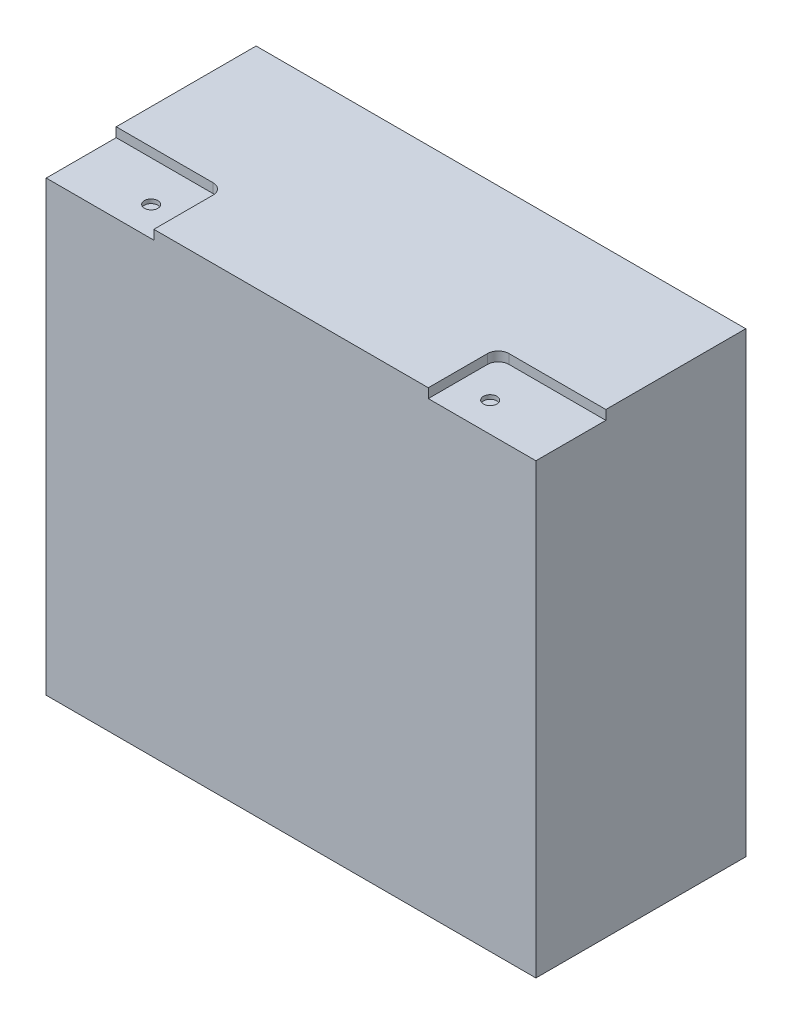
ISO-10303-21;
HEADER;
FILE_DESCRIPTION(('STEP AP214'),'2;1');
FILE_NAME('part.step','',(''),(''),'','','');
FILE_SCHEMA(('AUTOMOTIVE_DESIGN { 1 0 10303 214 1 1 1 1 }'));
ENDSEC;
DATA;
#1=APPLICATION_CONTEXT('core data for automotive mechanical design processes');
#2=APPLICATION_PROTOCOL_DEFINITION('international standard','automotive_design',2000,#1);
#3=PRODUCT_CONTEXT('',#1,'mechanical');
#4=PRODUCT('Part','Part','',(#3));
#5=PRODUCT_RELATED_PRODUCT_CATEGORY('part','',(#4));
#6=PRODUCT_DEFINITION_FORMATION('','',#4);
#7=PRODUCT_DEFINITION_CONTEXT('part definition',#1,'design');
#8=PRODUCT_DEFINITION('design','',#6,#7);
#9=PRODUCT_DEFINITION_SHAPE('','',#8);
#10=(LENGTH_UNIT() NAMED_UNIT(*) SI_UNIT(.MILLI.,.METRE.));
#11=(NAMED_UNIT(*) PLANE_ANGLE_UNIT() SI_UNIT($,.RADIAN.));
#12=(NAMED_UNIT(*) SI_UNIT($,.STERADIAN.) SOLID_ANGLE_UNIT());
#13=UNCERTAINTY_MEASURE_WITH_UNIT(LENGTH_MEASURE(1.E-05),#10,'distance_accuracy_value','');
#14=(GEOMETRIC_REPRESENTATION_CONTEXT(3) GLOBAL_UNCERTAINTY_ASSIGNED_CONTEXT((#13)) GLOBAL_UNIT_ASSIGNED_CONTEXT((#10,
#11,#12)) REPRESENTATION_CONTEXT('',''));
#15=CARTESIAN_POINT('',(0.,0.,0.));
#16=DIRECTION('',(0.,0.,1.));
#17=DIRECTION('',(1.,0.,0.));
#18=AXIS2_PLACEMENT_3D('',#15,#16,#17);
#19=CARTESIAN_POINT('',(91.,170.,39.));
#20=DIRECTION('',(-1.,0.,0.));
#21=DIRECTION('',(0.,0.,1.));
#22=AXIS2_PLACEMENT_3D('',#19,#20,#21);
#23=PLANE('',#22);
#24=DIRECTION('',(0.,0.,-1.));
#25=VECTOR('',#24,1.);
#26=CARTESIAN_POINT('',(91.,170.,39.));
#27=LINE('',#26,#25);
#28=CARTESIAN_POINT('',(91.,170.,13.));
#29=VERTEX_POINT('',#28);
#30=CARTESIAN_POINT('',(91.,170.,-39.));
#31=VERTEX_POINT('',#30);
#32=EDGE_CURVE('E231',#29,#31,#27,.T.);
#33=ORIENTED_EDGE('',*,*,#32,.F.);
#34=DIRECTION('',(0.,1.,0.));
#35=VECTOR('',#34,1.);
#36=CARTESIAN_POINT('',(91.,166.5,13.));
#37=LINE('',#36,#35);
#38=CARTESIAN_POINT('',(91.,166.5,13.));
#39=VERTEX_POINT('',#38);
#40=EDGE_CURVE('E200',#39,#29,#37,.T.);
#41=ORIENTED_EDGE('',*,*,#40,.F.);
#42=DIRECTION('',(0.,0.,-1.));
#43=VECTOR('',#42,1.);
#44=CARTESIAN_POINT('',(91.,166.5,39.));
#45=LINE('',#44,#43);
#46=CARTESIAN_POINT('',(91.,166.5,39.));
#47=VERTEX_POINT('',#46);
#48=EDGE_CURVE('E220',#47,#39,#45,.T.);
#49=ORIENTED_EDGE('',*,*,#48,.F.);
#50=DIRECTION('',(0.,-1.,0.));
#51=VECTOR('',#50,1.);
#52=CARTESIAN_POINT('',(91.,170.,39.));
#53=LINE('',#52,#51);
#54=CARTESIAN_POINT('',(91.,0.,39.));
#55=VERTEX_POINT('',#54);
#56=EDGE_CURVE('E154',#47,#55,#53,.T.);
#57=ORIENTED_EDGE('',*,*,#56,.T.);
#58=DIRECTION('',(0.,0.,-1.));
#59=VECTOR('',#58,1.);
#60=CARTESIAN_POINT('',(91.,0.,39.));
#61=LINE('',#60,#59);
#62=CARTESIAN_POINT('',(91.,0.,-39.));
#63=VERTEX_POINT('',#62);
#64=EDGE_CURVE('E228',#55,#63,#61,.T.);
#65=ORIENTED_EDGE('',*,*,#64,.T.);
#66=DIRECTION('',(0.,-1.,0.));
#67=VECTOR('',#66,1.);
#68=CARTESIAN_POINT('',(91.,170.,-39.));
#69=LINE('',#68,#67);
#70=EDGE_CURVE('E156',#31,#63,#69,.T.);
#71=ORIENTED_EDGE('',*,*,#70,.F.);
#72=EDGE_LOOP('',(#33,#41,#49,#57,#65,#71));
#73=FACE_BOUND('',#72,.T.);
#74=ADVANCED_FACE('F37',(#73),#23,.F.);
#75=CARTESIAN_POINT('',(-91.,170.,-39.));
#76=DIRECTION('',(0.,0.,1.));
#77=DIRECTION('',(1.,0.,0.));
#78=AXIS2_PLACEMENT_3D('',#75,#76,#77);
#79=PLANE('',#78);
#80=DIRECTION('',(-1.,0.,0.));
#81=VECTOR('',#80,1.);
#82=CARTESIAN_POINT('',(-91.,0.,-39.));
#83=LINE('',#82,#81);
#84=CARTESIAN_POINT('',(-91.,0.,-39.));
#85=VERTEX_POINT('',#84);
#86=EDGE_CURVE('E241',#63,#85,#83,.T.);
#87=ORIENTED_EDGE('',*,*,#86,.T.);
#88=DIRECTION('',(0.,-1.,0.));
#89=VECTOR('',#88,1.);
#90=CARTESIAN_POINT('',(-91.,170.,-39.));
#91=LINE('',#90,#89);
#92=CARTESIAN_POINT('',(-91.,170.,-39.));
#93=VERTEX_POINT('',#92);
#94=EDGE_CURVE('E153',#93,#85,#91,.T.);
#95=ORIENTED_EDGE('',*,*,#94,.F.);
#96=DIRECTION('',(-1.,0.,0.));
#97=VECTOR('',#96,1.);
#98=CARTESIAN_POINT('',(-91.,170.,-39.));
#99=LINE('',#98,#97);
#100=EDGE_CURVE('E233',#31,#93,#99,.T.);
#101=ORIENTED_EDGE('',*,*,#100,.F.);
#102=ORIENTED_EDGE('',*,*,#70,.T.);
#103=EDGE_LOOP('',(#87,#95,#101,#102));
#104=FACE_BOUND('',#103,.T.);
#105=ADVANCED_FACE('F268',(#104),#79,.F.);
#106=CARTESIAN_POINT('',(-91.,170.,39.));
#107=DIRECTION('',(1.,0.,0.));
#108=DIRECTION('',(0.,0.,-1.));
#109=AXIS2_PLACEMENT_3D('',#106,#107,#108);
#110=PLANE('',#109);
#111=DIRECTION('',(0.,0.,1.));
#112=VECTOR('',#111,1.);
#113=CARTESIAN_POINT('',(-91.,166.5,39.));
#114=LINE('',#113,#112);
#115=CARTESIAN_POINT('',(-91.,166.5,13.));
#116=VERTEX_POINT('',#115);
#117=CARTESIAN_POINT('',(-91.,166.5,39.));
#118=VERTEX_POINT('',#117);
#119=EDGE_CURVE('E125',#116,#118,#114,.T.);
#120=ORIENTED_EDGE('',*,*,#119,.F.);
#121=DIRECTION('',(0.,1.,0.));
#122=VECTOR('',#121,1.);
#123=CARTESIAN_POINT('',(-91.,166.5,13.));
#124=LINE('',#123,#122);
#125=CARTESIAN_POINT('',(-91.,170.,13.));
#126=VERTEX_POINT('',#125);
#127=EDGE_CURVE('E169',#116,#126,#124,.T.);
#128=ORIENTED_EDGE('',*,*,#127,.T.);
#129=DIRECTION('',(0.,0.,1.));
#130=VECTOR('',#129,1.);
#131=CARTESIAN_POINT('',(-91.,170.,39.));
#132=LINE('',#131,#130);
#133=EDGE_CURVE('E236',#93,#126,#132,.T.);
#134=ORIENTED_EDGE('',*,*,#133,.F.);
#135=ORIENTED_EDGE('',*,*,#94,.T.);
#136=DIRECTION('',(0.,0.,1.));
#137=VECTOR('',#136,1.);
#138=CARTESIAN_POINT('',(-91.,0.,39.));
#139=LINE('',#138,#137);
#140=CARTESIAN_POINT('',(-91.,0.,39.));
#141=VERTEX_POINT('',#140);
#142=EDGE_CURVE('E151',#85,#141,#139,.T.);
#143=ORIENTED_EDGE('',*,*,#142,.T.);
#144=DIRECTION('',(0.,-1.,0.));
#145=VECTOR('',#144,1.);
#146=CARTESIAN_POINT('',(-91.,170.,39.));
#147=LINE('',#146,#145);
#148=EDGE_CURVE('E143',#118,#141,#147,.T.);
#149=ORIENTED_EDGE('',*,*,#148,.F.);
#150=EDGE_LOOP('',(#120,#128,#134,#135,#143,#149));
#151=FACE_BOUND('',#150,.T.);
#152=ADVANCED_FACE('F148',(#151),#110,.F.);
#153=CARTESIAN_POINT('',(-91.,170.,39.));
#154=DIRECTION('',(0.,0.,-1.));
#155=DIRECTION('',(-1.,0.,0.));
#156=AXIS2_PLACEMENT_3D('',#153,#154,#155);
#157=PLANE('',#156);
#158=DIRECTION('',(1.,0.,0.));
#159=VECTOR('',#158,1.);
#160=CARTESIAN_POINT('',(-91.,170.,39.));
#161=LINE('',#160,#159);
#162=CARTESIAN_POINT('',(-51.,170.,39.));
#163=VERTEX_POINT('',#162);
#164=CARTESIAN_POINT('',(51.,170.,39.));
#165=VERTEX_POINT('',#164);
#166=EDGE_CURVE('E158',#163,#165,#161,.T.);
#167=ORIENTED_EDGE('',*,*,#166,.F.);
#168=DIRECTION('',(0.,1.,0.));
#169=VECTOR('',#168,1.);
#170=CARTESIAN_POINT('',(-51.,166.5,39.));
#171=LINE('',#170,#169);
#172=CARTESIAN_POINT('',(-51.,166.5,39.));
#173=VERTEX_POINT('',#172);
#174=EDGE_CURVE('E145',#173,#163,#171,.T.);
#175=ORIENTED_EDGE('',*,*,#174,.F.);
#176=DIRECTION('',(1.,0.,0.));
#177=VECTOR('',#176,1.);
#178=CARTESIAN_POINT('',(-91.,166.5,39.));
#179=LINE('',#178,#177);
#180=EDGE_CURVE('E129',#118,#173,#179,.T.);
#181=ORIENTED_EDGE('',*,*,#180,.F.);
#182=ORIENTED_EDGE('',*,*,#148,.T.);
#183=DIRECTION('',(1.,0.,0.));
#184=VECTOR('',#183,1.);
#185=CARTESIAN_POINT('',(-91.,0.,39.));
#186=LINE('',#185,#184);
#187=EDGE_CURVE('E234',#141,#55,#186,.T.);
#188=ORIENTED_EDGE('',*,*,#187,.T.);
#189=ORIENTED_EDGE('',*,*,#56,.F.);
#190=DIRECTION('',(1.,0.,0.));
#191=VECTOR('',#190,1.);
#192=CARTESIAN_POINT('',(91.,166.5,39.));
#193=LINE('',#192,#191);
#194=CARTESIAN_POINT('',(51.,166.5,39.));
#195=VERTEX_POINT('',#194);
#196=EDGE_CURVE('E218',#195,#47,#193,.T.);
#197=ORIENTED_EDGE('',*,*,#196,.F.);
#198=DIRECTION('',(0.,1.,0.));
#199=VECTOR('',#198,1.);
#200=CARTESIAN_POINT('',(51.,166.5,39.));
#201=LINE('',#200,#199);
#202=EDGE_CURVE('E216',#195,#165,#201,.T.);
#203=ORIENTED_EDGE('',*,*,#202,.T.);
#204=EDGE_LOOP('',(#167,#175,#181,#182,#188,#189,#197,#203));
#205=FACE_BOUND('',#204,.T.);
#206=ADVANCED_FACE('F141',(#205),#157,.F.);
#207=CARTESIAN_POINT('',(0.,170.,0.));
#208=DIRECTION('',(0.,-1.,0.));
#209=DIRECTION('',(0.,0.,-1.));
#210=AXIS2_PLACEMENT_3D('',#207,#208,#209);
#211=PLANE('',#210);
#212=ORIENTED_EDGE('',*,*,#133,.T.);
#213=DIRECTION('',(-1.,0.,0.));
#214=VECTOR('',#213,1.);
#215=CARTESIAN_POINT('',(-91.,170.,13.));
#216=LINE('',#215,#214);
#217=CARTESIAN_POINT('',(-55.,170.,13.));
#218=VERTEX_POINT('',#217);
#219=EDGE_CURVE('E137',#218,#126,#216,.T.);
#220=ORIENTED_EDGE('',*,*,#219,.F.);
#221=CARTESIAN_POINT('',(-55.,170.,17.));
#222=DIRECTION('',(0.,-1.,0.));
#223=DIRECTION('',(0.,0.,-1.));
#224=AXIS2_PLACEMENT_3D('',#221,#222,#223);
#225=CIRCLE('',#224,4.);
#226=CARTESIAN_POINT('',(-51.,170.,17.));
#227=VERTEX_POINT('',#226);
#228=EDGE_CURVE('E11',#218,#227,#225,.T.);
#229=ORIENTED_EDGE('',*,*,#228,.T.);
#230=DIRECTION('',(0.,0.,-1.));
#231=VECTOR('',#230,1.);
#232=CARTESIAN_POINT('',(-51.,170.,39.));
#233=LINE('',#232,#231);
#234=EDGE_CURVE('E201',#163,#227,#233,.T.);
#235=ORIENTED_EDGE('',*,*,#234,.F.);
#236=ORIENTED_EDGE('',*,*,#166,.T.);
#237=DIRECTION('',(0.,0.,1.));
#238=VECTOR('',#237,1.);
#239=CARTESIAN_POINT('',(51.,170.,39.));
#240=LINE('',#239,#238);
#241=CARTESIAN_POINT('',(51.,170.,17.));
#242=VERTEX_POINT('',#241);
#243=EDGE_CURVE('E192',#242,#165,#240,.T.);
#244=ORIENTED_EDGE('',*,*,#243,.F.);
#245=CARTESIAN_POINT('',(55.,170.,17.));
#246=DIRECTION('',(0.,-1.,0.));
#247=DIRECTION('',(0.,0.,-1.));
#248=AXIS2_PLACEMENT_3D('',#245,#246,#247);
#249=CIRCLE('',#248,4.);
#250=CARTESIAN_POINT('',(55.,170.,13.));
#251=VERTEX_POINT('',#250);
#252=EDGE_CURVE('E45',#242,#251,#249,.T.);
#253=ORIENTED_EDGE('',*,*,#252,.T.);
#254=DIRECTION('',(-1.,0.,0.));
#255=VECTOR('',#254,1.);
#256=CARTESIAN_POINT('',(91.,170.,13.));
#257=LINE('',#256,#255);
#258=EDGE_CURVE('E189',#29,#251,#257,.T.);
#259=ORIENTED_EDGE('',*,*,#258,.F.);
#260=ORIENTED_EDGE('',*,*,#32,.T.);
#261=ORIENTED_EDGE('',*,*,#100,.T.);
#262=EDGE_LOOP('',(#212,#220,#229,#235,#236,#244,#253,#259,#260,#261));
#263=FACE_BOUND('',#262,.T.);
#264=ADVANCED_FACE('F188',(#263),#211,.F.);
#265=CARTESIAN_POINT('',(0.,0.,0.));
#266=DIRECTION('',(0.,-1.,0.));
#267=DIRECTION('',(0.,0.,-1.));
#268=AXIS2_PLACEMENT_3D('',#265,#266,#267);
#269=PLANE('',#268);
#270=ORIENTED_EDGE('',*,*,#64,.F.);
#271=ORIENTED_EDGE('',*,*,#187,.F.);
#272=ORIENTED_EDGE('',*,*,#142,.F.);
#273=ORIENTED_EDGE('',*,*,#86,.F.);
#274=EDGE_LOOP('',(#270,#271,#272,#273));
#275=FACE_BOUND('',#274,.T.);
#276=ADVANCED_FACE('F246',(#275),#269,.T.);
#277=CARTESIAN_POINT('',(0.,166.5,0.));
#278=DIRECTION('',(0.,1.,0.));
#279=DIRECTION('',(0.,0.,1.));
#280=AXIS2_PLACEMENT_3D('',#277,#278,#279);
#281=PLANE('',#280);
#282=DIRECTION('',(-1.,0.,0.));
#283=VECTOR('',#282,1.);
#284=CARTESIAN_POINT('',(91.,166.5,13.));
#285=LINE('',#284,#283);
#286=CARTESIAN_POINT('',(55.,166.5,13.));
#287=VERTEX_POINT('',#286);
#288=EDGE_CURVE('E212',#39,#287,#285,.T.);
#289=ORIENTED_EDGE('',*,*,#288,.T.);
#290=CARTESIAN_POINT('',(55.,166.5,17.));
#291=DIRECTION('',(0.,1.,0.));
#292=DIRECTION('',(0.,0.,1.));
#293=AXIS2_PLACEMENT_3D('',#290,#291,#292);
#294=CIRCLE('',#293,4.);
#295=CARTESIAN_POINT('',(51.,166.5,17.));
#296=VERTEX_POINT('',#295);
#297=EDGE_CURVE('E177',#287,#296,#294,.T.);
#298=ORIENTED_EDGE('',*,*,#297,.T.);
#299=DIRECTION('',(0.,0.,1.));
#300=VECTOR('',#299,1.);
#301=CARTESIAN_POINT('',(51.,166.5,39.));
#302=LINE('',#301,#300);
#303=EDGE_CURVE('E209',#296,#195,#302,.T.);
#304=ORIENTED_EDGE('',*,*,#303,.T.);
#305=ORIENTED_EDGE('',*,*,#196,.T.);
#306=ORIENTED_EDGE('',*,*,#48,.T.);
#307=EDGE_LOOP('',(#289,#298,#304,#305,#306));
#308=FACE_BOUND('',#307,.T.);
#309=CARTESIAN_POINT('',(63.,166.5,28.));
#310=DIRECTION('',(0.,1.,0.));
#311=DIRECTION('',(0.,0.,1.));
#312=AXIS2_PLACEMENT_3D('',#309,#310,#311);
#313=CIRCLE('',#312,2.50000000000001);
#314=CARTESIAN_POINT('',(63.,166.5,30.5));
#315=VERTEX_POINT('',#314);
#316=EDGE_CURVE('E165',#315,#315,#313,.F.);
#317=ORIENTED_EDGE('',*,*,#316,.T.);
#318=EDGE_LOOP('',(#317));
#319=FACE_BOUND('',#318,.T.);
#320=ADVANCED_FACE('F207',(#308,#319),#281,.T.);
#321=CARTESIAN_POINT('',(51.,166.5,39.));
#322=DIRECTION('',(-1.,0.,0.));
#323=DIRECTION('',(0.,0.,1.));
#324=AXIS2_PLACEMENT_3D('',#321,#322,#323);
#325=PLANE('',#324);
#326=ORIENTED_EDGE('',*,*,#303,.F.);
#327=DIRECTION('',(0.,1.,0.));
#328=VECTOR('',#327,1.);
#329=CARTESIAN_POINT('',(51.,170.,17.));
#330=LINE('',#329,#328);
#331=EDGE_CURVE('E164',#296,#242,#330,.T.);
#332=ORIENTED_EDGE('',*,*,#331,.T.);
#333=ORIENTED_EDGE('',*,*,#243,.T.);
#334=ORIENTED_EDGE('',*,*,#202,.F.);
#335=EDGE_LOOP('',(#326,#332,#333,#334));
#336=FACE_BOUND('',#335,.T.);
#337=ADVANCED_FACE('F214',(#336),#325,.F.);
#338=CARTESIAN_POINT('',(91.,166.5,13.));
#339=DIRECTION('',(0.,0.,-1.));
#340=DIRECTION('',(-1.,0.,0.));
#341=AXIS2_PLACEMENT_3D('',#338,#339,#340);
#342=PLANE('',#341);
#343=ORIENTED_EDGE('',*,*,#258,.T.);
#344=DIRECTION('',(0.,1.,0.));
#345=VECTOR('',#344,1.);
#346=CARTESIAN_POINT('',(55.,166.5,13.));
#347=LINE('',#346,#345);
#348=EDGE_CURVE('E175',#251,#287,#347,.F.);
#349=ORIENTED_EDGE('',*,*,#348,.T.);
#350=ORIENTED_EDGE('',*,*,#288,.F.);
#351=ORIENTED_EDGE('',*,*,#40,.T.);
#352=EDGE_LOOP('',(#343,#349,#350,#351));
#353=FACE_BOUND('',#352,.T.);
#354=ADVANCED_FACE('F197',(#353),#342,.F.);
#355=CARTESIAN_POINT('',(0.,166.5,0.));
#356=DIRECTION('',(0.,-1.,0.));
#357=DIRECTION('',(0.,0.,-1.));
#358=AXIS2_PLACEMENT_3D('',#355,#356,#357);
#359=PLANE('',#358);
#360=DIRECTION('',(0.,0.,-1.));
#361=VECTOR('',#360,1.);
#362=CARTESIAN_POINT('',(-51.,166.5,39.));
#363=LINE('',#362,#361);
#364=CARTESIAN_POINT('',(-51.,166.5,17.));
#365=VERTEX_POINT('',#364);
#366=EDGE_CURVE('E146',#173,#365,#363,.T.);
#367=ORIENTED_EDGE('',*,*,#366,.T.);
#368=CARTESIAN_POINT('',(-55.,166.5,17.));
#369=DIRECTION('',(0.,-1.,0.));
#370=DIRECTION('',(0.,0.,-1.));
#371=AXIS2_PLACEMENT_3D('',#368,#369,#370);
#372=CIRCLE('',#371,4.);
#373=CARTESIAN_POINT('',(-55.,166.5,13.));
#374=VERTEX_POINT('',#373);
#375=EDGE_CURVE('E183',#365,#374,#372,.F.);
#376=ORIENTED_EDGE('',*,*,#375,.T.);
#377=DIRECTION('',(-1.,0.,0.));
#378=VECTOR('',#377,1.);
#379=CARTESIAN_POINT('',(-91.,166.5,13.));
#380=LINE('',#379,#378);
#381=EDGE_CURVE('E132',#374,#116,#380,.T.);
#382=ORIENTED_EDGE('',*,*,#381,.T.);
#383=ORIENTED_EDGE('',*,*,#119,.T.);
#384=ORIENTED_EDGE('',*,*,#180,.T.);
#385=EDGE_LOOP('',(#367,#376,#382,#383,#384));
#386=FACE_BOUND('',#385,.T.);
#387=CARTESIAN_POINT('',(-62.9999999999998,166.5,28.0000000000004));
#388=DIRECTION('',(0.,-1.,0.));
#389=DIRECTION('',(0.,0.,-1.));
#390=AXIS2_PLACEMENT_3D('',#387,#388,#389);
#391=CIRCLE('',#390,2.50000000000001);
#392=CARTESIAN_POINT('',(-62.9999999999998,166.5,25.5000000000004));
#393=VERTEX_POINT('',#392);
#394=EDGE_CURVE('E168',#393,#393,#391,.F.);
#395=ORIENTED_EDGE('',*,*,#394,.F.);
#396=EDGE_LOOP('',(#395));
#397=FACE_BOUND('',#396,.T.);
#398=ADVANCED_FACE('F127',(#386,#397),#359,.F.);
#399=CARTESIAN_POINT('',(-91.,166.5,13.));
#400=DIRECTION('',(0.,0.,-1.));
#401=DIRECTION('',(-1.,0.,0.));
#402=AXIS2_PLACEMENT_3D('',#399,#400,#401);
#403=PLANE('',#402);
#404=ORIENTED_EDGE('',*,*,#381,.F.);
#405=DIRECTION('',(0.,1.,0.));
#406=VECTOR('',#405,1.);
#407=CARTESIAN_POINT('',(-55.,170.,13.));
#408=LINE('',#407,#406);
#409=EDGE_CURVE('E179',#374,#218,#408,.T.);
#410=ORIENTED_EDGE('',*,*,#409,.T.);
#411=ORIENTED_EDGE('',*,*,#219,.T.);
#412=ORIENTED_EDGE('',*,*,#127,.F.);
#413=EDGE_LOOP('',(#404,#410,#411,#412));
#414=FACE_BOUND('',#413,.T.);
#415=ADVANCED_FACE('F263',(#414),#403,.F.);
#416=CARTESIAN_POINT('',(-51.,166.5,39.));
#417=DIRECTION('',(1.,0.,0.));
#418=DIRECTION('',(0.,0.,-1.));
#419=AXIS2_PLACEMENT_3D('',#416,#417,#418);
#420=PLANE('',#419);
#421=ORIENTED_EDGE('',*,*,#234,.T.);
#422=DIRECTION('',(0.,1.,0.));
#423=VECTOR('',#422,1.);
#424=CARTESIAN_POINT('',(-51.,166.5,17.));
#425=LINE('',#424,#423);
#426=EDGE_CURVE('E52',#227,#365,#425,.F.);
#427=ORIENTED_EDGE('',*,*,#426,.T.);
#428=ORIENTED_EDGE('',*,*,#366,.F.);
#429=ORIENTED_EDGE('',*,*,#174,.T.);
#430=EDGE_LOOP('',(#421,#427,#428,#429));
#431=FACE_BOUND('',#430,.T.);
#432=ADVANCED_FACE('F345',(#431),#420,.F.);
#433=CARTESIAN_POINT('',(63.,165.,28.));
#434=DIRECTION('',(0.,1.,0.));
#435=DIRECTION('',(0.,0.,1.));
#436=AXIS2_PLACEMENT_3D('',#433,#434,#435);
#437=PLANE('',#436);
#438=CARTESIAN_POINT('',(63.,165.,28.));
#439=DIRECTION('',(0.,1.,0.));
#440=DIRECTION('',(0.,0.,1.));
#441=AXIS2_PLACEMENT_3D('',#438,#439,#440);
#442=CIRCLE('',#441,2.50000000000001);
#443=CARTESIAN_POINT('',(63.,165.,30.5));
#444=VERTEX_POINT('',#443);
#445=EDGE_CURVE('E225',#444,#444,#442,.T.);
#446=ORIENTED_EDGE('',*,*,#445,.T.);
#447=EDGE_LOOP('',(#446));
#448=FACE_BOUND('',#447,.T.);
#449=ADVANCED_FACE('F352',(#448),#437,.T.);
#450=CARTESIAN_POINT('',(63.,165.,28.));
#451=DIRECTION('',(0.,1.,0.));
#452=DIRECTION('',(0.,0.,1.));
#453=AXIS2_PLACEMENT_3D('',#450,#451,#452);
#454=CYLINDRICAL_SURFACE('',#453,2.50000000000001);
#455=ORIENTED_EDGE('',*,*,#445,.F.);
#456=EDGE_LOOP('',(#455));
#457=FACE_BOUND('',#456,.T.);
#458=ORIENTED_EDGE('',*,*,#316,.F.);
#459=EDGE_LOOP('',(#458));
#460=FACE_BOUND('',#459,.T.);
#461=ADVANCED_FACE('F290',(#457,#460),#454,.F.);
#462=CARTESIAN_POINT('',(-62.9999999999998,165.,28.0000000000004));
#463=DIRECTION('',(0.,-1.,0.));
#464=DIRECTION('',(0.,0.,-1.));
#465=AXIS2_PLACEMENT_3D('',#462,#463,#464);
#466=PLANE('',#465);
#467=CARTESIAN_POINT('',(-62.9999999999998,165.,28.0000000000004));
#468=DIRECTION('',(0.,1.,0.));
#469=DIRECTION('',(0.,0.,-1.));
#470=AXIS2_PLACEMENT_3D('',#467,#468,#469);
#471=CIRCLE('',#470,2.50000000000001);
#472=CARTESIAN_POINT('',(-62.9999999999998,165.,25.5000000000004));
#473=VERTEX_POINT('',#472);
#474=EDGE_CURVE('E172',#473,#473,#471,.T.);
#475=ORIENTED_EDGE('',*,*,#474,.T.);
#476=EDGE_LOOP('',(#475));
#477=FACE_BOUND('',#476,.T.);
#478=ADVANCED_FACE('F284',(#477),#466,.F.);
#479=CARTESIAN_POINT('',(-62.9999999999998,165.,28.0000000000004));
#480=DIRECTION('',(0.,1.,0.));
#481=DIRECTION('',(0.,0.,1.));
#482=AXIS2_PLACEMENT_3D('',#479,#480,#481);
#483=CYLINDRICAL_SURFACE('',#482,2.50000000000001);
#484=ORIENTED_EDGE('',*,*,#394,.T.);
#485=EDGE_LOOP('',(#484));
#486=FACE_BOUND('',#485,.T.);
#487=ORIENTED_EDGE('',*,*,#474,.F.);
#488=EDGE_LOOP('',(#487));
#489=FACE_BOUND('',#488,.T.);
#490=ADVANCED_FACE('F279',(#486,#489),#483,.F.);
#491=CARTESIAN_POINT('',(55.,166.5,17.));
#492=DIRECTION('',(0.,-1.,0.));
#493=DIRECTION('',(0.,0.,-1.));
#494=AXIS2_PLACEMENT_3D('',#491,#492,#493);
#495=CYLINDRICAL_SURFACE('',#494,4.);
#496=ORIENTED_EDGE('',*,*,#297,.F.);
#497=ORIENTED_EDGE('',*,*,#348,.F.);
#498=ORIENTED_EDGE('',*,*,#252,.F.);
#499=ORIENTED_EDGE('',*,*,#331,.F.);
#500=EDGE_LOOP('',(#496,#497,#498,#499));
#501=FACE_BOUND('',#500,.T.);
#502=ADVANCED_FACE('F204',(#501),#495,.F.);
#503=CARTESIAN_POINT('',(-55.,166.5,17.));
#504=DIRECTION('',(0.,-1.,0.));
#505=DIRECTION('',(0.,0.,-1.));
#506=AXIS2_PLACEMENT_3D('',#503,#504,#505);
#507=CYLINDRICAL_SURFACE('',#506,4.);
#508=ORIENTED_EDGE('',*,*,#375,.F.);
#509=ORIENTED_EDGE('',*,*,#426,.F.);
#510=ORIENTED_EDGE('',*,*,#228,.F.);
#511=ORIENTED_EDGE('',*,*,#409,.F.);
#512=EDGE_LOOP('',(#508,#509,#510,#511));
#513=FACE_BOUND('',#512,.T.);
#514=ADVANCED_FACE('F39',(#513),#507,.F.);
#515=CLOSED_SHELL('',(#74,#105,#152,#206,#264,#276,#320,#337,#354,#398,#415,#432,#449,#461,#478,
#490,#502,#514));
#516=MANIFOLD_SOLID_BREP('B2',#515);
#517=ADVANCED_BREP_SHAPE_REPRESENTATION('',(#18,#516),#14);
#518=SHAPE_DEFINITION_REPRESENTATION(#9,#517);
ENDSEC;
END-ISO-10303-21;
